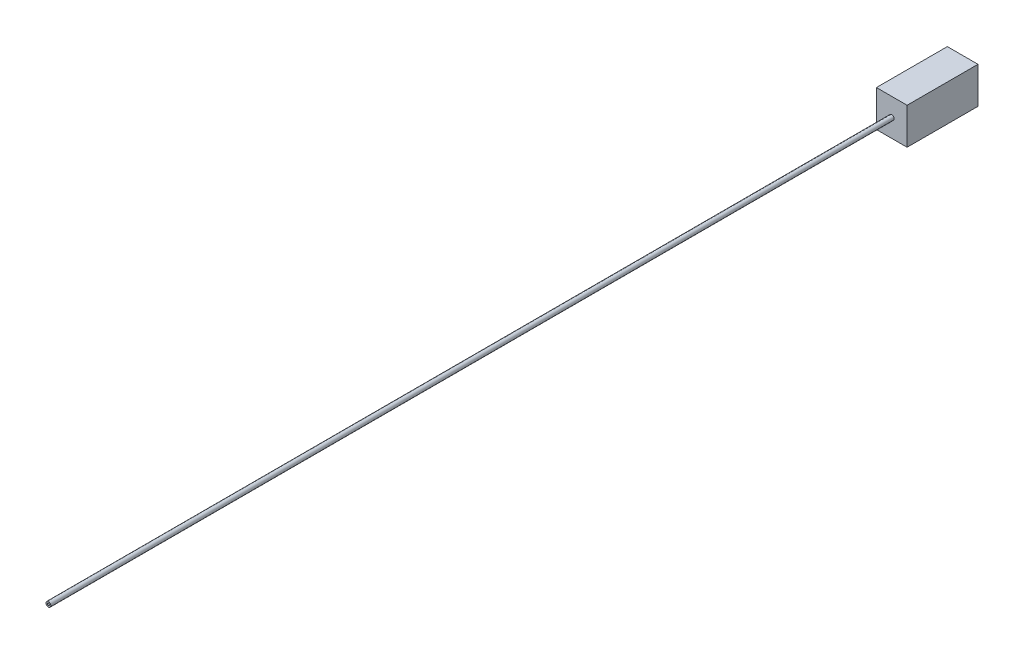
ISO-10303-21;
HEADER;
FILE_DESCRIPTION(('STEP AP214'),'2;1');
FILE_NAME('part.step','',(''),(''),'','','');
FILE_SCHEMA(('AUTOMOTIVE_DESIGN { 1 0 10303 214 1 1 1 1 }'));
ENDSEC;
DATA;
#1=APPLICATION_CONTEXT('core data for automotive mechanical design processes');
#2=APPLICATION_PROTOCOL_DEFINITION('international standard','automotive_design',2000,#1);
#3=PRODUCT_CONTEXT('',#1,'mechanical');
#4=PRODUCT('Part','Part','',(#3));
#5=PRODUCT_RELATED_PRODUCT_CATEGORY('part','',(#4));
#6=PRODUCT_DEFINITION_FORMATION('','',#4);
#7=PRODUCT_DEFINITION_CONTEXT('part definition',#1,'design');
#8=PRODUCT_DEFINITION('design','',#6,#7);
#9=PRODUCT_DEFINITION_SHAPE('','',#8);
#10=(LENGTH_UNIT() NAMED_UNIT(*) SI_UNIT(.MILLI.,.METRE.));
#11=(NAMED_UNIT(*) PLANE_ANGLE_UNIT() SI_UNIT($,.RADIAN.));
#12=(NAMED_UNIT(*) SI_UNIT($,.STERADIAN.) SOLID_ANGLE_UNIT());
#13=UNCERTAINTY_MEASURE_WITH_UNIT(LENGTH_MEASURE(1.E-05),#10,'distance_accuracy_value','');
#14=(GEOMETRIC_REPRESENTATION_CONTEXT(3) GLOBAL_UNCERTAINTY_ASSIGNED_CONTEXT((#13)) GLOBAL_UNIT_ASSIGNED_CONTEXT((#10,
#11,#12)) REPRESENTATION_CONTEXT('',''));
#15=CARTESIAN_POINT('',(0.,0.,0.));
#16=DIRECTION('',(0.,0.,1.));
#17=DIRECTION('',(1.,0.,0.));
#18=AXIS2_PLACEMENT_3D('',#15,#16,#17);
#19=CARTESIAN_POINT('',(-4.,-4.75,18.5));
#20=DIRECTION('',(1.,0.,0.));
#21=DIRECTION('',(0.,0.,-1.));
#22=AXIS2_PLACEMENT_3D('',#19,#20,#21);
#23=PLANE('',#22);
#24=DIRECTION('',(0.,-1.,0.));
#25=VECTOR('',#24,1.);
#26=CARTESIAN_POINT('',(-4.,-4.75,0.));
#27=LINE('',#26,#25);
#28=CARTESIAN_POINT('',(-4.,4.75,0.));
#29=VERTEX_POINT('',#28);
#30=CARTESIAN_POINT('',(-4.,-4.75,0.));
#31=VERTEX_POINT('',#30);
#32=EDGE_CURVE('E99',#29,#31,#27,.T.);
#33=ORIENTED_EDGE('',*,*,#32,.T.);
#34=DIRECTION('',(0.,0.,-1.));
#35=VECTOR('',#34,1.);
#36=CARTESIAN_POINT('',(-4.,-4.75,18.5));
#37=LINE('',#36,#35);
#38=CARTESIAN_POINT('',(-4.,-4.75,18.5));
#39=VERTEX_POINT('',#38);
#40=EDGE_CURVE('E11',#39,#31,#37,.T.);
#41=ORIENTED_EDGE('',*,*,#40,.F.);
#42=DIRECTION('',(0.,-1.,0.));
#43=VECTOR('',#42,1.);
#44=CARTESIAN_POINT('',(-4.,-4.75,18.5));
#45=LINE('',#44,#43);
#46=CARTESIAN_POINT('',(-4.,4.75,18.5));
#47=VERTEX_POINT('',#46);
#48=EDGE_CURVE('E86',#47,#39,#45,.T.);
#49=ORIENTED_EDGE('',*,*,#48,.F.);
#50=DIRECTION('',(0.,0.,-1.));
#51=VECTOR('',#50,1.);
#52=CARTESIAN_POINT('',(-4.,4.75,18.5));
#53=LINE('',#52,#51);
#54=EDGE_CURVE('E95',#47,#29,#53,.T.);
#55=ORIENTED_EDGE('',*,*,#54,.T.);
#56=EDGE_LOOP('',(#33,#41,#49,#55));
#57=FACE_BOUND('',#56,.T.);
#58=ADVANCED_FACE('F34',(#57),#23,.F.);
#59=CARTESIAN_POINT('',(4.,-4.75,18.5));
#60=DIRECTION('',(0.,1.,0.));
#61=DIRECTION('',(-1.,0.,0.));
#62=AXIS2_PLACEMENT_3D('',#59,#60,#61);
#63=PLANE('',#62);
#64=DIRECTION('',(1.,0.,0.));
#65=VECTOR('',#64,1.);
#66=CARTESIAN_POINT('',(4.,-4.75,0.));
#67=LINE('',#66,#65);
#68=CARTESIAN_POINT('',(4.,-4.75,0.));
#69=VERTEX_POINT('',#68);
#70=EDGE_CURVE('E90',#31,#69,#67,.T.);
#71=ORIENTED_EDGE('',*,*,#70,.T.);
#72=DIRECTION('',(0.,0.,-1.));
#73=VECTOR('',#72,1.);
#74=CARTESIAN_POINT('',(4.,-4.75,18.5));
#75=LINE('',#74,#73);
#76=CARTESIAN_POINT('',(4.,-4.75,18.5));
#77=VERTEX_POINT('',#76);
#78=EDGE_CURVE('E43',#77,#69,#75,.T.);
#79=ORIENTED_EDGE('',*,*,#78,.F.);
#80=DIRECTION('',(1.,0.,0.));
#81=VECTOR('',#80,1.);
#82=CARTESIAN_POINT('',(4.,-4.75,18.5));
#83=LINE('',#82,#81);
#84=EDGE_CURVE('E81',#39,#77,#83,.T.);
#85=ORIENTED_EDGE('',*,*,#84,.F.);
#86=ORIENTED_EDGE('',*,*,#40,.T.);
#87=EDGE_LOOP('',(#71,#79,#85,#86));
#88=FACE_BOUND('',#87,.T.);
#89=ADVANCED_FACE('F89',(#88),#63,.F.);
#90=CARTESIAN_POINT('',(4.,-4.75,18.5));
#91=DIRECTION('',(-1.,0.,0.));
#92=DIRECTION('',(0.,0.,1.));
#93=AXIS2_PLACEMENT_3D('',#90,#91,#92);
#94=PLANE('',#93);
#95=DIRECTION('',(0.,1.,0.));
#96=VECTOR('',#95,1.);
#97=CARTESIAN_POINT('',(4.,-4.75,0.));
#98=LINE('',#97,#96);
#99=CARTESIAN_POINT('',(4.,4.75,0.));
#100=VERTEX_POINT('',#99);
#101=EDGE_CURVE('E68',#69,#100,#98,.T.);
#102=ORIENTED_EDGE('',*,*,#101,.T.);
#103=DIRECTION('',(0.,0.,-1.));
#104=VECTOR('',#103,1.);
#105=CARTESIAN_POINT('',(4.,4.75,18.5));
#106=LINE('',#105,#104);
#107=CARTESIAN_POINT('',(4.,4.75,18.5));
#108=VERTEX_POINT('',#107);
#109=EDGE_CURVE('E91',#108,#100,#106,.T.);
#110=ORIENTED_EDGE('',*,*,#109,.F.);
#111=DIRECTION('',(0.,1.,0.));
#112=VECTOR('',#111,1.);
#113=CARTESIAN_POINT('',(4.,-4.75,18.5));
#114=LINE('',#113,#112);
#115=EDGE_CURVE('E84',#77,#108,#114,.T.);
#116=ORIENTED_EDGE('',*,*,#115,.F.);
#117=ORIENTED_EDGE('',*,*,#78,.T.);
#118=EDGE_LOOP('',(#102,#110,#116,#117));
#119=FACE_BOUND('',#118,.T.);
#120=ADVANCED_FACE('F93',(#119),#94,.F.);
#121=CARTESIAN_POINT('',(4.,4.75,18.5));
#122=DIRECTION('',(0.,-1.,0.));
#123=DIRECTION('',(1.,0.,0.));
#124=AXIS2_PLACEMENT_3D('',#121,#122,#123);
#125=PLANE('',#124);
#126=DIRECTION('',(-1.,0.,0.));
#127=VECTOR('',#126,1.);
#128=CARTESIAN_POINT('',(4.,4.75,0.));
#129=LINE('',#128,#127);
#130=EDGE_CURVE('E74',#100,#29,#129,.T.);
#131=ORIENTED_EDGE('',*,*,#130,.T.);
#132=ORIENTED_EDGE('',*,*,#54,.F.);
#133=DIRECTION('',(-1.,0.,0.));
#134=VECTOR('',#133,1.);
#135=CARTESIAN_POINT('',(4.,4.75,18.5));
#136=LINE('',#135,#134);
#137=EDGE_CURVE('E51',#108,#47,#136,.T.);
#138=ORIENTED_EDGE('',*,*,#137,.F.);
#139=ORIENTED_EDGE('',*,*,#109,.T.);
#140=EDGE_LOOP('',(#131,#132,#138,#139));
#141=FACE_BOUND('',#140,.T.);
#142=ADVANCED_FACE('F107',(#141),#125,.F.);
#143=CARTESIAN_POINT('',(0.,0.,18.5));
#144=DIRECTION('',(0.,0.,1.));
#145=DIRECTION('',(1.,0.,0.));
#146=AXIS2_PLACEMENT_3D('',#143,#144,#145);
#147=PLANE('',#146);
#148=CARTESIAN_POINT('',(0.,0.,18.5));
#149=DIRECTION('',(0.,0.,1.));
#150=DIRECTION('',(1.,0.,0.));
#151=AXIS2_PLACEMENT_3D('',#148,#149,#150);
#152=CIRCLE('',#151,0.625);
#153=CARTESIAN_POINT('',(0.625,0.,18.5));
#154=VERTEX_POINT('',#153);
#155=EDGE_CURVE('E113',#154,#154,#152,.T.);
#156=ORIENTED_EDGE('',*,*,#155,.F.);
#157=EDGE_LOOP('',(#156));
#158=FACE_BOUND('',#157,.T.);
#159=ORIENTED_EDGE('',*,*,#48,.T.);
#160=ORIENTED_EDGE('',*,*,#84,.T.);
#161=ORIENTED_EDGE('',*,*,#115,.T.);
#162=ORIENTED_EDGE('',*,*,#137,.T.);
#163=EDGE_LOOP('',(#159,#160,#161,#162));
#164=FACE_BOUND('',#163,.T.);
#165=ADVANCED_FACE('F82',(#158,#164),#147,.T.);
#166=CARTESIAN_POINT('',(0.,0.,0.));
#167=DIRECTION('',(0.,0.,1.));
#168=DIRECTION('',(1.,0.,0.));
#169=AXIS2_PLACEMENT_3D('',#166,#167,#168);
#170=PLANE('',#169);
#171=CARTESIAN_POINT('',(0.,0.,0.));
#172=DIRECTION('',(0.,0.,1.));
#173=DIRECTION('',(1.,0.,0.));
#174=AXIS2_PLACEMENT_3D('',#171,#172,#173);
#175=CIRCLE('',#174,0.25);
#176=CARTESIAN_POINT('',(0.25,0.,0.));
#177=VERTEX_POINT('',#176);
#178=EDGE_CURVE('E37',#177,#177,#175,.T.);
#179=ORIENTED_EDGE('',*,*,#178,.T.);
#180=EDGE_LOOP('',(#179));
#181=FACE_BOUND('',#180,.T.);
#182=ORIENTED_EDGE('',*,*,#32,.F.);
#183=ORIENTED_EDGE('',*,*,#130,.F.);
#184=ORIENTED_EDGE('',*,*,#101,.F.);
#185=ORIENTED_EDGE('',*,*,#70,.F.);
#186=EDGE_LOOP('',(#182,#183,#184,#185));
#187=FACE_BOUND('',#186,.T.);
#188=ADVANCED_FACE('F110',(#181,#187),#170,.F.);
#189=CARTESIAN_POINT('',(0.,0.,238.5));
#190=DIRECTION('',(0.,0.,1.));
#191=DIRECTION('',(1.,0.,0.));
#192=AXIS2_PLACEMENT_3D('',#189,#190,#191);
#193=PLANE('',#192);
#194=CARTESIAN_POINT('',(0.,0.,238.5));
#195=DIRECTION('',(0.,0.,1.));
#196=DIRECTION('',(1.,0.,0.));
#197=AXIS2_PLACEMENT_3D('',#194,#195,#196);
#198=CIRCLE('',#197,0.625);
#199=CARTESIAN_POINT('',(0.625,0.,238.5));
#200=VERTEX_POINT('',#199);
#201=EDGE_CURVE('E102',#200,#200,#198,.T.);
#202=ORIENTED_EDGE('',*,*,#201,.T.);
#203=EDGE_LOOP('',(#202));
#204=FACE_BOUND('',#203,.T.);
#205=CARTESIAN_POINT('',(0.,0.,238.5));
#206=DIRECTION('',(0.,0.,1.));
#207=DIRECTION('',(1.,0.,0.));
#208=AXIS2_PLACEMENT_3D('',#205,#206,#207);
#209=CIRCLE('',#208,0.25);
#210=CARTESIAN_POINT('',(0.25,0.,238.5));
#211=VERTEX_POINT('',#210);
#212=EDGE_CURVE('E116',#211,#211,#209,.T.);
#213=ORIENTED_EDGE('',*,*,#212,.F.);
#214=EDGE_LOOP('',(#213));
#215=FACE_BOUND('',#214,.T.);
#216=ADVANCED_FACE('F133',(#204,#215),#193,.T.);
#217=CARTESIAN_POINT('',(0.,0.,238.5));
#218=DIRECTION('',(0.,0.,-1.));
#219=DIRECTION('',(-1.,0.,0.));
#220=AXIS2_PLACEMENT_3D('',#217,#218,#219);
#221=CYLINDRICAL_SURFACE('',#220,0.625);
#222=ORIENTED_EDGE('',*,*,#201,.F.);
#223=EDGE_LOOP('',(#222));
#224=FACE_BOUND('',#223,.T.);
#225=ORIENTED_EDGE('',*,*,#155,.T.);
#226=EDGE_LOOP('',(#225));
#227=FACE_BOUND('',#226,.T.);
#228=ADVANCED_FACE('F128',(#224,#227),#221,.T.);
#229=CARTESIAN_POINT('',(0.,0.,238.5));
#230=DIRECTION('',(0.,0.,-1.));
#231=DIRECTION('',(-1.,0.,0.));
#232=AXIS2_PLACEMENT_3D('',#229,#230,#231);
#233=CYLINDRICAL_SURFACE('',#232,0.25);
#234=ORIENTED_EDGE('',*,*,#212,.T.);
#235=EDGE_LOOP('',(#234));
#236=FACE_BOUND('',#235,.T.);
#237=ORIENTED_EDGE('',*,*,#178,.F.);
#238=EDGE_LOOP('',(#237));
#239=FACE_BOUND('',#238,.T.);
#240=ADVANCED_FACE('F126',(#236,#239),#233,.F.);
#241=CLOSED_SHELL('',(#58,#89,#120,#142,#165,#188,#216,#228,#240));
#242=MANIFOLD_SOLID_BREP('B2',#241);
#243=ADVANCED_BREP_SHAPE_REPRESENTATION('',(#18,#242),#14);
#244=SHAPE_DEFINITION_REPRESENTATION(#9,#243);
ENDSEC;
END-ISO-10303-21;
